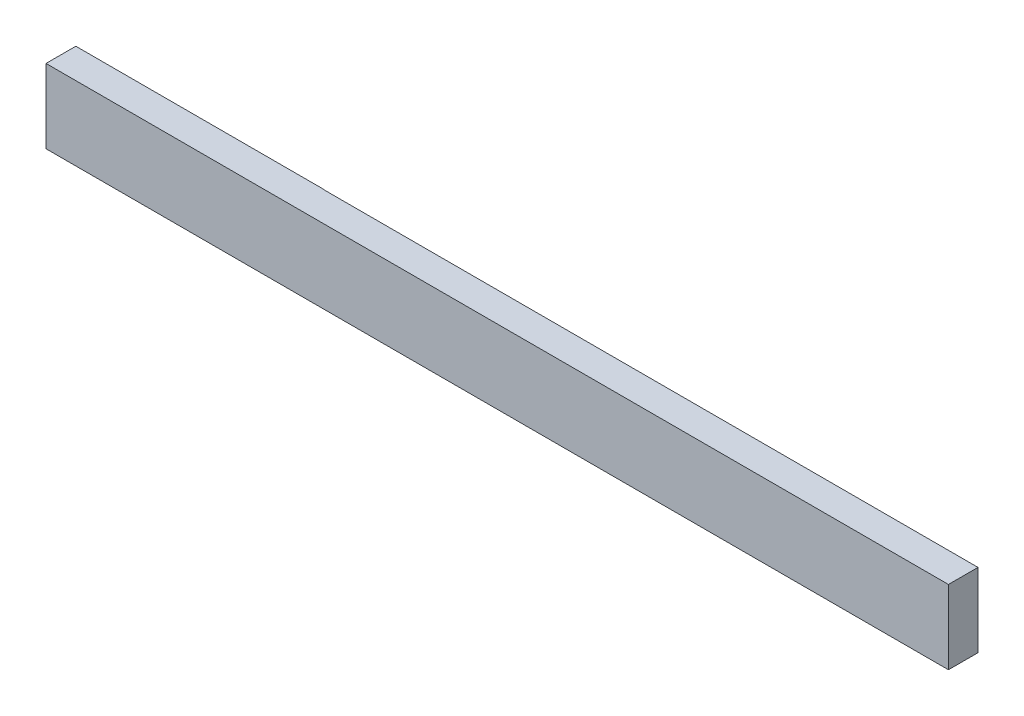
ISO-10303-21;
HEADER;
FILE_DESCRIPTION(('STEP AP214'),'2;1');
FILE_NAME('part.step','',(''),(''),'','','');
FILE_SCHEMA(('AUTOMOTIVE_DESIGN { 1 0 10303 214 1 1 1 1 }'));
ENDSEC;
DATA;
#1=APPLICATION_CONTEXT('core data for automotive mechanical design processes');
#2=APPLICATION_PROTOCOL_DEFINITION('international standard','automotive_design',2000,#1);
#3=PRODUCT_CONTEXT('',#1,'mechanical');
#4=PRODUCT('Part','Part','',(#3));
#5=PRODUCT_RELATED_PRODUCT_CATEGORY('part','',(#4));
#6=PRODUCT_DEFINITION_FORMATION('','',#4);
#7=PRODUCT_DEFINITION_CONTEXT('part definition',#1,'design');
#8=PRODUCT_DEFINITION('design','',#6,#7);
#9=PRODUCT_DEFINITION_SHAPE('','',#8);
#10=(LENGTH_UNIT() NAMED_UNIT(*) SI_UNIT(.MILLI.,.METRE.));
#11=(NAMED_UNIT(*) PLANE_ANGLE_UNIT() SI_UNIT($,.RADIAN.));
#12=(NAMED_UNIT(*) SI_UNIT($,.STERADIAN.) SOLID_ANGLE_UNIT());
#13=UNCERTAINTY_MEASURE_WITH_UNIT(LENGTH_MEASURE(1.E-05),#10,'distance_accuracy_value','');
#14=(GEOMETRIC_REPRESENTATION_CONTEXT(3) GLOBAL_UNCERTAINTY_ASSIGNED_CONTEXT((#13)) GLOBAL_UNIT_ASSIGNED_CONTEXT((#10,
#11,#12)) REPRESENTATION_CONTEXT('',''));
#15=CARTESIAN_POINT('',(0.,0.,0.));
#16=DIRECTION('',(0.,0.,1.));
#17=DIRECTION('',(1.,0.,0.));
#18=AXIS2_PLACEMENT_3D('',#15,#16,#17);
#19=CARTESIAN_POINT('',(47.,10.,0.));
#20=DIRECTION('',(-1.,0.,0.));
#21=DIRECTION('',(0.,0.,1.));
#22=AXIS2_PLACEMENT_3D('',#19,#20,#21);
#23=PLANE('',#22);
#24=DIRECTION('',(0.,-1.,0.));
#25=VECTOR('',#24,1.);
#26=CARTESIAN_POINT('',(47.,10.,-4.));
#27=LINE('',#26,#25);
#28=CARTESIAN_POINT('',(47.,10.,-4.));
#29=VERTEX_POINT('',#28);
#30=CARTESIAN_POINT('',(47.,0.,-4.));
#31=VERTEX_POINT('',#30);
#32=EDGE_CURVE('E96',#29,#31,#27,.T.);
#33=ORIENTED_EDGE('',*,*,#32,.F.);
#34=DIRECTION('',(0.,0.,-1.));
#35=VECTOR('',#34,1.);
#36=CARTESIAN_POINT('',(47.,10.,0.));
#37=LINE('',#36,#35);
#38=CARTESIAN_POINT('',(47.,10.,0.));
#39=VERTEX_POINT('',#38);
#40=EDGE_CURVE('E131',#39,#29,#37,.T.);
#41=ORIENTED_EDGE('',*,*,#40,.F.);
#42=DIRECTION('',(0.,-1.,0.));
#43=VECTOR('',#42,1.);
#44=CARTESIAN_POINT('',(47.,10.,0.));
#45=LINE('',#44,#43);
#46=CARTESIAN_POINT('',(47.,0.,0.));
#47=VERTEX_POINT('',#46);
#48=EDGE_CURVE('E134',#39,#47,#45,.T.);
#49=ORIENTED_EDGE('',*,*,#48,.T.);
#50=DIRECTION('',(0.,0.,-1.));
#51=VECTOR('',#50,1.);
#52=CARTESIAN_POINT('',(47.,0.,0.));
#53=LINE('',#52,#51);
#54=EDGE_CURVE('E132',#47,#31,#53,.T.);
#55=ORIENTED_EDGE('',*,*,#54,.T.);
#56=EDGE_LOOP('',(#33,#41,#49,#55));
#57=FACE_BOUND('',#56,.T.);
#58=ADVANCED_FACE('F38',(#57),#23,.F.);
#59=CARTESIAN_POINT('',(0.,10.,0.));
#60=DIRECTION('',(0.,0.,-1.));
#61=DIRECTION('',(-1.,0.,0.));
#62=AXIS2_PLACEMENT_3D('',#59,#60,#61);
#63=PLANE('',#62);
#64=DIRECTION('',(1.,0.,0.));
#65=VECTOR('',#64,1.);
#66=CARTESIAN_POINT('',(0.,0.,0.));
#67=LINE('',#66,#65);
#68=CARTESIAN_POINT('',(-75.1,0.,0.));
#69=VERTEX_POINT('',#68);
#70=EDGE_CURVE('E129',#69,#47,#67,.T.);
#71=ORIENTED_EDGE('',*,*,#70,.T.);
#72=ORIENTED_EDGE('',*,*,#48,.F.);
#73=DIRECTION('',(1.,0.,0.));
#74=VECTOR('',#73,1.);
#75=CARTESIAN_POINT('',(0.,10.,0.));
#76=LINE('',#75,#74);
#77=CARTESIAN_POINT('',(-75.1,10.,0.));
#78=VERTEX_POINT('',#77);
#79=EDGE_CURVE('E62',#78,#39,#76,.T.);
#80=ORIENTED_EDGE('',*,*,#79,.F.);
#81=DIRECTION('',(0.,1.,0.));
#82=VECTOR('',#81,1.);
#83=CARTESIAN_POINT('',(-75.1,0.,0.));
#84=LINE('',#83,#82);
#85=EDGE_CURVE('E120',#69,#78,#84,.T.);
#86=ORIENTED_EDGE('',*,*,#85,.F.);
#87=EDGE_LOOP('',(#71,#72,#80,#86));
#88=FACE_BOUND('',#87,.T.);
#89=ADVANCED_FACE('F40',(#88),#63,.F.);
#90=CARTESIAN_POINT('',(0.,10.,0.));
#91=DIRECTION('',(0.,-1.,0.));
#92=DIRECTION('',(0.,0.,-1.));
#93=AXIS2_PLACEMENT_3D('',#90,#91,#92);
#94=PLANE('',#93);
#95=DIRECTION('',(1.,0.,0.));
#96=VECTOR('',#95,1.);
#97=CARTESIAN_POINT('',(0.,10.,-4.));
#98=LINE('',#97,#96);
#99=CARTESIAN_POINT('',(-41.50042161418,10.,-4.));
#100=VERTEX_POINT('',#99);
#101=EDGE_CURVE('E112',#100,#29,#98,.T.);
#102=ORIENTED_EDGE('',*,*,#101,.F.);
#103=DIRECTION('',(0.,0.,-1.));
#104=VECTOR('',#103,1.);
#105=CARTESIAN_POINT('',(-41.50042161418,10.,0.));
#106=LINE('',#105,#104);
#107=CARTESIAN_POINT('',(-41.50042161418,10.,-4.03568810142474));
#108=VERTEX_POINT('',#107);
#109=EDGE_CURVE('E102',#100,#108,#106,.T.);
#110=ORIENTED_EDGE('',*,*,#109,.T.);
#111=DIRECTION('',(1.,0.,0.));
#112=VECTOR('',#111,1.);
#113=CARTESIAN_POINT('',(-75.1,10.,-4.03568810142474));
#114=LINE('',#113,#112);
#115=CARTESIAN_POINT('',(-75.1,10.,-4.03568810142474));
#116=VERTEX_POINT('',#115);
#117=EDGE_CURVE('E125',#116,#108,#114,.T.);
#118=ORIENTED_EDGE('',*,*,#117,.F.);
#119=DIRECTION('',(0.,0.,-1.));
#120=VECTOR('',#119,1.);
#121=CARTESIAN_POINT('',(-75.1,10.,-4.03568810142474));
#122=LINE('',#121,#120);
#123=EDGE_CURVE('E123',#78,#116,#122,.T.);
#124=ORIENTED_EDGE('',*,*,#123,.F.);
#125=ORIENTED_EDGE('',*,*,#79,.T.);
#126=ORIENTED_EDGE('',*,*,#40,.T.);
#127=EDGE_LOOP('',(#102,#110,#118,#124,#125,#126));
#128=FACE_BOUND('',#127,.T.);
#129=ADVANCED_FACE('F142',(#128),#94,.F.);
#130=CARTESIAN_POINT('',(0.,0.,0.));
#131=DIRECTION('',(0.,-1.,0.));
#132=DIRECTION('',(0.,0.,-1.));
#133=AXIS2_PLACEMENT_3D('',#130,#131,#132);
#134=PLANE('',#133);
#135=DIRECTION('',(0.,0.,-1.));
#136=VECTOR('',#135,1.);
#137=CARTESIAN_POINT('',(-41.50042161418,0.,0.));
#138=LINE('',#137,#136);
#139=CARTESIAN_POINT('',(-41.50042161418,0.,-4.));
#140=VERTEX_POINT('',#139);
#141=CARTESIAN_POINT('',(-41.50042161418,0.,-4.03568810142474));
#142=VERTEX_POINT('',#141);
#143=EDGE_CURVE('E53',#140,#142,#138,.T.);
#144=ORIENTED_EDGE('',*,*,#143,.F.);
#145=DIRECTION('',(1.,0.,0.));
#146=VECTOR('',#145,1.);
#147=CARTESIAN_POINT('',(0.,0.,-4.));
#148=LINE('',#147,#146);
#149=EDGE_CURVE('E11',#140,#31,#148,.T.);
#150=ORIENTED_EDGE('',*,*,#149,.T.);
#151=ORIENTED_EDGE('',*,*,#54,.F.);
#152=ORIENTED_EDGE('',*,*,#70,.F.);
#153=DIRECTION('',(0.,0.,1.));
#154=VECTOR('',#153,1.);
#155=CARTESIAN_POINT('',(-75.1,0.,-4.03568810142474));
#156=LINE('',#155,#154);
#157=CARTESIAN_POINT('',(-75.1,0.,-4.03568810142474));
#158=VERTEX_POINT('',#157);
#159=EDGE_CURVE('E117',#158,#69,#156,.T.);
#160=ORIENTED_EDGE('',*,*,#159,.F.);
#161=DIRECTION('',(1.,0.,0.));
#162=VECTOR('',#161,1.);
#163=CARTESIAN_POINT('',(-75.1,0.,-4.03568810142474));
#164=LINE('',#163,#162);
#165=EDGE_CURVE('E107',#158,#142,#164,.T.);
#166=ORIENTED_EDGE('',*,*,#165,.T.);
#167=EDGE_LOOP('',(#144,#150,#151,#152,#160,#166));
#168=FACE_BOUND('',#167,.T.);
#169=ADVANCED_FACE('F105',(#168),#134,.T.);
#170=CARTESIAN_POINT('',(-75.1,0.,-4.03568810142474));
#171=DIRECTION('',(0.,0.,1.));
#172=DIRECTION('',(1.,0.,0.));
#173=AXIS2_PLACEMENT_3D('',#170,#171,#172);
#174=PLANE('',#173);
#175=ORIENTED_EDGE('',*,*,#117,.T.);
#176=DIRECTION('',(0.,-1.,0.));
#177=VECTOR('',#176,1.);
#178=CARTESIAN_POINT('',(-41.50042161418,0.,-4.03568810142474));
#179=LINE('',#178,#177);
#180=EDGE_CURVE('E46',#108,#142,#179,.T.);
#181=ORIENTED_EDGE('',*,*,#180,.T.);
#182=ORIENTED_EDGE('',*,*,#165,.F.);
#183=DIRECTION('',(0.,-1.,0.));
#184=VECTOR('',#183,1.);
#185=CARTESIAN_POINT('',(-75.1,0.,-4.03568810142474));
#186=LINE('',#185,#184);
#187=EDGE_CURVE('E114',#116,#158,#186,.T.);
#188=ORIENTED_EDGE('',*,*,#187,.F.);
#189=EDGE_LOOP('',(#175,#181,#182,#188));
#190=FACE_BOUND('',#189,.T.);
#191=ADVANCED_FACE('F139',(#190),#174,.F.);
#192=CARTESIAN_POINT('',(-75.1,0.,0.));
#193=DIRECTION('',(1.,0.,0.));
#194=DIRECTION('',(0.,0.,-1.));
#195=AXIS2_PLACEMENT_3D('',#192,#193,#194);
#196=PLANE('',#195);
#197=ORIENTED_EDGE('',*,*,#187,.T.);
#198=ORIENTED_EDGE('',*,*,#159,.T.);
#199=ORIENTED_EDGE('',*,*,#85,.T.);
#200=ORIENTED_EDGE('',*,*,#123,.T.);
#201=EDGE_LOOP('',(#197,#198,#199,#200));
#202=FACE_BOUND('',#201,.T.);
#203=ADVANCED_FACE('F148',(#202),#196,.F.);
#204=CARTESIAN_POINT('',(0.,0.,-4.));
#205=DIRECTION('',(0.,0.,-1.));
#206=DIRECTION('',(-1.,0.,0.));
#207=AXIS2_PLACEMENT_3D('',#204,#205,#206);
#208=PLANE('',#207);
#209=ORIENTED_EDGE('',*,*,#101,.T.);
#210=ORIENTED_EDGE('',*,*,#32,.T.);
#211=ORIENTED_EDGE('',*,*,#149,.F.);
#212=DIRECTION('',(0.,1.,0.));
#213=VECTOR('',#212,1.);
#214=CARTESIAN_POINT('',(-41.50042161418,37.5313890764201,-4.));
#215=LINE('',#214,#213);
#216=EDGE_CURVE('E93',#140,#100,#215,.T.);
#217=ORIENTED_EDGE('',*,*,#216,.T.);
#218=EDGE_LOOP('',(#209,#210,#211,#217));
#219=FACE_BOUND('',#218,.T.);
#220=ADVANCED_FACE('F92',(#219),#208,.T.);
#221=CARTESIAN_POINT('',(-41.50042161418,37.5313890764201,-4.));
#222=DIRECTION('',(-1.,0.,0.));
#223=DIRECTION('',(0.,0.,1.));
#224=AXIS2_PLACEMENT_3D('',#221,#222,#223);
#225=PLANE('',#224);
#226=ORIENTED_EDGE('',*,*,#216,.F.);
#227=ORIENTED_EDGE('',*,*,#143,.T.);
#228=ORIENTED_EDGE('',*,*,#180,.F.);
#229=ORIENTED_EDGE('',*,*,#109,.F.);
#230=EDGE_LOOP('',(#226,#227,#228,#229));
#231=FACE_BOUND('',#230,.T.);
#232=ADVANCED_FACE('F100',(#231),#225,.F.);
#233=CLOSED_SHELL('',(#58,#89,#129,#169,#191,#203,#220,#232));
#234=MANIFOLD_SOLID_BREP('B2',#233);
#235=ADVANCED_BREP_SHAPE_REPRESENTATION('',(#18,#234),#14);
#236=SHAPE_DEFINITION_REPRESENTATION(#9,#235);
ENDSEC;
END-ISO-10303-21;
